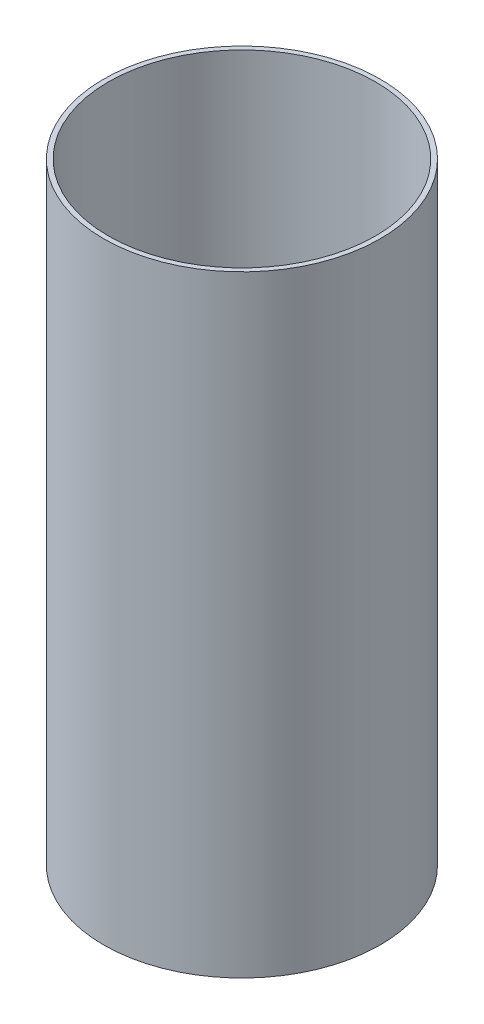
ISO-10303-21;
HEADER;
FILE_DESCRIPTION(('STEP AP214'),'2;1');
FILE_NAME('part.step','',(''),(''),'','','');
FILE_SCHEMA(('AUTOMOTIVE_DESIGN { 1 0 10303 214 1 1 1 1 }'));
ENDSEC;
DATA;
#1=APPLICATION_CONTEXT('core data for automotive mechanical design processes');
#2=APPLICATION_PROTOCOL_DEFINITION('international standard','automotive_design',2000,#1);
#3=PRODUCT_CONTEXT('',#1,'mechanical');
#4=PRODUCT('Part','Part','',(#3));
#5=PRODUCT_RELATED_PRODUCT_CATEGORY('part','',(#4));
#6=PRODUCT_DEFINITION_FORMATION('','',#4);
#7=PRODUCT_DEFINITION_CONTEXT('part definition',#1,'design');
#8=PRODUCT_DEFINITION('design','',#6,#7);
#9=PRODUCT_DEFINITION_SHAPE('','',#8);
#10=(LENGTH_UNIT() NAMED_UNIT(*) SI_UNIT(.MILLI.,.METRE.));
#11=(NAMED_UNIT(*) PLANE_ANGLE_UNIT() SI_UNIT($,.RADIAN.));
#12=(NAMED_UNIT(*) SI_UNIT($,.STERADIAN.) SOLID_ANGLE_UNIT());
#13=UNCERTAINTY_MEASURE_WITH_UNIT(LENGTH_MEASURE(1.E-05),#10,'distance_accuracy_value','');
#14=(GEOMETRIC_REPRESENTATION_CONTEXT(3) GLOBAL_UNCERTAINTY_ASSIGNED_CONTEXT((#13)) GLOBAL_UNIT_ASSIGNED_CONTEXT((#10,
#11,#12)) REPRESENTATION_CONTEXT('',''));
#15=CARTESIAN_POINT('',(0.,0.,0.));
#16=DIRECTION('',(0.,0.,1.));
#17=DIRECTION('',(1.,0.,0.));
#18=AXIS2_PLACEMENT_3D('',#15,#16,#17);
#19=CARTESIAN_POINT('',(0.,203.581,0.));
#20=DIRECTION('',(0.,1.,0.));
#21=DIRECTION('',(0.,0.,1.));
#22=AXIS2_PLACEMENT_3D('',#19,#20,#21);
#23=PLANE('',#22);
#24=CARTESIAN_POINT('',(0.,203.581,0.));
#25=DIRECTION('',(0.,1.,0.));
#26=DIRECTION('',(0.,0.,1.));
#27=AXIS2_PLACEMENT_3D('',#24,#25,#26);
#28=CIRCLE('',#27,92.075);
#29=CARTESIAN_POINT('',(0.,203.581,92.075));
#30=VERTEX_POINT('',#29);
#31=EDGE_CURVE('E10',#30,#30,#28,.T.);
#32=ORIENTED_EDGE('',*,*,#31,.T.);
#33=EDGE_LOOP('',(#32));
#34=FACE_BOUND('',#33,.T.);
#35=CARTESIAN_POINT('',(0.,203.581,0.));
#36=DIRECTION('',(0.,1.,0.));
#37=DIRECTION('',(0.,0.,1.));
#38=AXIS2_PLACEMENT_3D('',#35,#36,#37);
#39=CIRCLE('',#38,88.9);
#40=CARTESIAN_POINT('',(0.,203.581,88.9));
#41=VERTEX_POINT('',#40);
#42=EDGE_CURVE('E52',#41,#41,#39,.T.);
#43=ORIENTED_EDGE('',*,*,#42,.F.);
#44=EDGE_LOOP('',(#43));
#45=FACE_BOUND('',#44,.T.);
#46=ADVANCED_FACE('F41',(#34,#45),#23,.T.);
#47=CARTESIAN_POINT('',(0.,-203.581,0.));
#48=DIRECTION('',(0.,1.,0.));
#49=DIRECTION('',(0.,0.,1.));
#50=AXIS2_PLACEMENT_3D('',#47,#48,#49);
#51=PLANE('',#50);
#52=CARTESIAN_POINT('',(0.,-203.581,0.));
#53=DIRECTION('',(0.,1.,0.));
#54=DIRECTION('',(0.,0.,1.));
#55=AXIS2_PLACEMENT_3D('',#52,#53,#54);
#56=CIRCLE('',#55,92.075);
#57=CARTESIAN_POINT('',(0.,-203.581,92.075));
#58=VERTEX_POINT('',#57);
#59=EDGE_CURVE('E45',#58,#58,#56,.T.);
#60=ORIENTED_EDGE('',*,*,#59,.F.);
#61=EDGE_LOOP('',(#60));
#62=FACE_BOUND('',#61,.T.);
#63=CARTESIAN_POINT('',(0.,-203.581,0.));
#64=DIRECTION('',(0.,1.,0.));
#65=DIRECTION('',(0.,0.,1.));
#66=AXIS2_PLACEMENT_3D('',#63,#64,#65);
#67=CIRCLE('',#66,88.9);
#68=CARTESIAN_POINT('',(0.,-203.581,88.9));
#69=VERTEX_POINT('',#68);
#70=EDGE_CURVE('E54',#69,#69,#67,.T.);
#71=ORIENTED_EDGE('',*,*,#70,.T.);
#72=EDGE_LOOP('',(#71));
#73=FACE_BOUND('',#72,.T.);
#74=ADVANCED_FACE('F64',(#62,#73),#51,.F.);
#75=CARTESIAN_POINT('',(0.,203.581,0.));
#76=DIRECTION('',(0.,-1.,0.));
#77=DIRECTION('',(0.,0.,-1.));
#78=AXIS2_PLACEMENT_3D('',#75,#76,#77);
#79=CYLINDRICAL_SURFACE('',#78,92.075);
#80=ORIENTED_EDGE('',*,*,#31,.F.);
#81=EDGE_LOOP('',(#80));
#82=FACE_BOUND('',#81,.T.);
#83=ORIENTED_EDGE('',*,*,#59,.T.);
#84=EDGE_LOOP('',(#83));
#85=FACE_BOUND('',#84,.T.);
#86=ADVANCED_FACE('F43',(#82,#85),#79,.T.);
#87=CARTESIAN_POINT('',(0.,203.581,0.));
#88=DIRECTION('',(0.,-1.,0.));
#89=DIRECTION('',(0.,0.,-1.));
#90=AXIS2_PLACEMENT_3D('',#87,#88,#89);
#91=CYLINDRICAL_SURFACE('',#90,88.9);
#92=ORIENTED_EDGE('',*,*,#42,.T.);
#93=EDGE_LOOP('',(#92));
#94=FACE_BOUND('',#93,.T.);
#95=ORIENTED_EDGE('',*,*,#70,.F.);
#96=EDGE_LOOP('',(#95));
#97=FACE_BOUND('',#96,.T.);
#98=ADVANCED_FACE('F60',(#94,#97),#91,.F.);
#99=CLOSED_SHELL('',(#46,#74,#86,#98));
#100=MANIFOLD_SOLID_BREP('B2',#99);
#101=ADVANCED_BREP_SHAPE_REPRESENTATION('',(#18,#100),#14);
#102=SHAPE_DEFINITION_REPRESENTATION(#9,#101);
ENDSEC;
END-ISO-10303-21;
